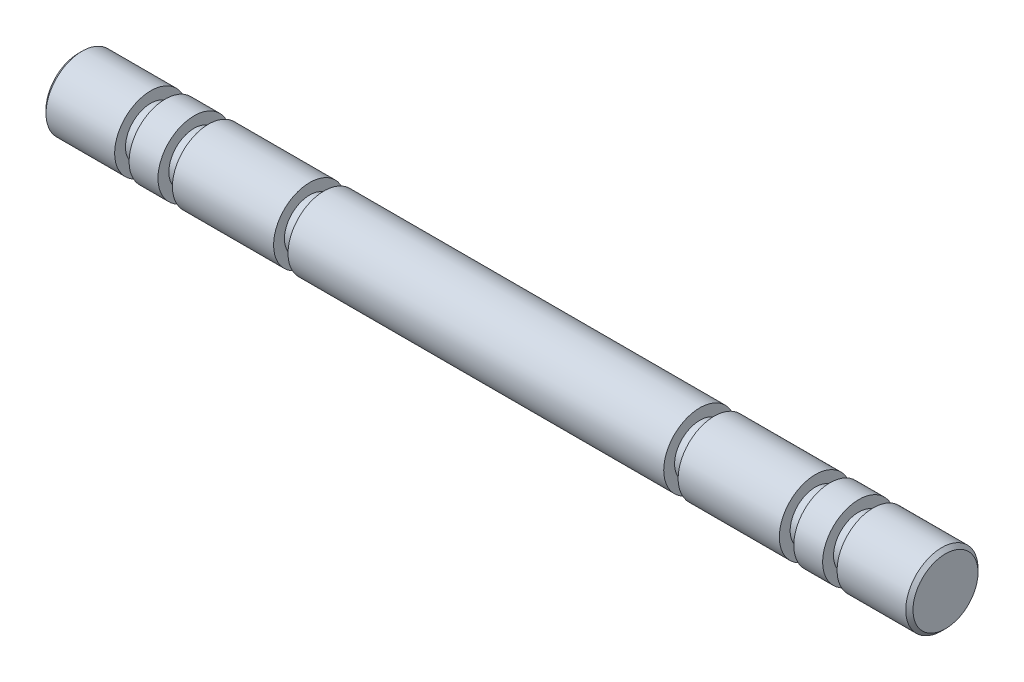
ISO-10303-21;
HEADER;
FILE_DESCRIPTION(('STEP AP214'),'2;1');
FILE_NAME('part.step','',(''),(''),'','','');
FILE_SCHEMA(('AUTOMOTIVE_DESIGN { 1 0 10303 214 1 1 1 1 }'));
ENDSEC;
DATA;
#1=APPLICATION_CONTEXT('core data for automotive mechanical design processes');
#2=APPLICATION_PROTOCOL_DEFINITION('international standard','automotive_design',2000,#1);
#3=PRODUCT_CONTEXT('',#1,'mechanical');
#4=PRODUCT('Part','Part','',(#3));
#5=PRODUCT_RELATED_PRODUCT_CATEGORY('part','',(#4));
#6=PRODUCT_DEFINITION_FORMATION('','',#4);
#7=PRODUCT_DEFINITION_CONTEXT('part definition',#1,'design');
#8=PRODUCT_DEFINITION('design','',#6,#7);
#9=PRODUCT_DEFINITION_SHAPE('','',#8);
#10=(LENGTH_UNIT() NAMED_UNIT(*) SI_UNIT(.MILLI.,.METRE.));
#11=(NAMED_UNIT(*) PLANE_ANGLE_UNIT() SI_UNIT($,.RADIAN.));
#12=(NAMED_UNIT(*) SI_UNIT($,.STERADIAN.) SOLID_ANGLE_UNIT());
#13=UNCERTAINTY_MEASURE_WITH_UNIT(LENGTH_MEASURE(1.E-05),#10,'distance_accuracy_value','');
#14=(GEOMETRIC_REPRESENTATION_CONTEXT(3) GLOBAL_UNCERTAINTY_ASSIGNED_CONTEXT((#13)) GLOBAL_UNIT_ASSIGNED_CONTEXT((#10,
#11,#12)) REPRESENTATION_CONTEXT('',''));
#15=CARTESIAN_POINT('',(0.,0.,0.));
#16=DIRECTION('',(0.,0.,1.));
#17=DIRECTION('',(1.,0.,0.));
#18=AXIS2_PLACEMENT_3D('',#15,#16,#17);
#19=CARTESIAN_POINT('',(52.,0.,0.));
#20=DIRECTION('',(-1.,0.,0.));
#21=DIRECTION('',(0.,0.,1.));
#22=AXIS2_PLACEMENT_3D('',#19,#20,#21);
#23=CYLINDRICAL_SURFACE('',#22,5.);
#24=CARTESIAN_POINT('',(52.,0.,0.));
#25=DIRECTION('',(1.,0.,0.));
#26=DIRECTION('',(0.,0.,-1.));
#27=AXIS2_PLACEMENT_3D('',#24,#25,#26);
#28=CIRCLE('',#27,5.);
#29=CARTESIAN_POINT('',(52.,0.,5.));
#30=VERTEX_POINT('',#29);
#31=EDGE_CURVE('E61',#30,#30,#28,.T.);
#32=CARTESIAN_POINT('',(0.,0.,0.));
#33=DIRECTION('',(1.,0.,0.));
#34=DIRECTION('',(0.,0.,-1.));
#35=AXIS2_PLACEMENT_3D('',#32,#33,#34);
#36=CIRCLE('',#35,5.);
#37=CARTESIAN_POINT('',(0.,0.,5.));
#38=VERTEX_POINT('',#37);
#39=EDGE_CURVE('E58',#38,#38,#36,.T.);
#40=CARTESIAN_POINT('',(52.,0.,5.));
#41=CARTESIAN_POINT('',(51.4583333333333,0.,5.));
#42=CARTESIAN_POINT('',(50.9166666666667,0.,5.));
#43=CARTESIAN_POINT('',(49.8333333333333,0.,5.));
#44=CARTESIAN_POINT('',(49.2916666666667,0.,5.));
#45=CARTESIAN_POINT('',(48.2083333333333,0.,5.));
#46=CARTESIAN_POINT('',(47.6666666666667,0.,5.));
#47=CARTESIAN_POINT('',(46.5833333333333,0.,5.));
#48=CARTESIAN_POINT('',(46.0416666666667,0.,5.));
#49=CARTESIAN_POINT('',(44.9583333333333,0.,5.));
#50=CARTESIAN_POINT('',(44.4166666666667,0.,5.));
#51=CARTESIAN_POINT('',(43.3333333333333,0.,5.));
#52=CARTESIAN_POINT('',(42.7916666666667,0.,5.));
#53=CARTESIAN_POINT('',(41.7083333333333,0.,5.));
#54=CARTESIAN_POINT('',(41.1666666666667,0.,5.));
#55=CARTESIAN_POINT('',(40.0833333333333,0.,5.));
#56=CARTESIAN_POINT('',(39.5416666666667,0.,5.));
#57=CARTESIAN_POINT('',(38.4583333333333,0.,5.));
#58=CARTESIAN_POINT('',(37.9166666666667,0.,5.));
#59=CARTESIAN_POINT('',(36.8333333333333,0.,5.));
#60=CARTESIAN_POINT('',(36.2916666666667,0.,5.));
#61=CARTESIAN_POINT('',(35.2083333333333,0.,5.));
#62=CARTESIAN_POINT('',(34.6666666666667,0.,5.));
#63=CARTESIAN_POINT('',(33.5833333333333,0.,5.));
#64=CARTESIAN_POINT('',(33.0416666666667,0.,5.));
#65=CARTESIAN_POINT('',(31.9583333333333,0.,5.));
#66=CARTESIAN_POINT('',(31.4166666666667,0.,5.));
#67=CARTESIAN_POINT('',(30.3333333333333,0.,5.));
#68=CARTESIAN_POINT('',(29.7916666666667,0.,5.));
#69=CARTESIAN_POINT('',(28.7083333333333,0.,5.));
#70=CARTESIAN_POINT('',(28.1666666666667,0.,5.));
#71=CARTESIAN_POINT('',(27.0833333333333,0.,5.));
#72=CARTESIAN_POINT('',(26.5416666666667,0.,5.));
#73=CARTESIAN_POINT('',(25.4583333333333,0.,5.));
#74=CARTESIAN_POINT('',(24.9166666666667,0.,5.));
#75=CARTESIAN_POINT('',(23.8333333333333,0.,5.));
#76=CARTESIAN_POINT('',(23.2916666666667,0.,5.));
#77=CARTESIAN_POINT('',(22.2083333333333,0.,5.));
#78=CARTESIAN_POINT('',(21.6666666666667,0.,5.));
#79=CARTESIAN_POINT('',(20.5833333333333,0.,5.));
#80=CARTESIAN_POINT('',(20.0416666666667,0.,5.));
#81=CARTESIAN_POINT('',(18.9583333333333,0.,5.));
#82=CARTESIAN_POINT('',(18.4166666666667,0.,5.));
#83=CARTESIAN_POINT('',(17.3333333333333,0.,5.));
#84=CARTESIAN_POINT('',(16.7916666666667,0.,5.));
#85=CARTESIAN_POINT('',(15.7083333333333,0.,5.));
#86=CARTESIAN_POINT('',(15.1666666666667,0.,5.));
#87=CARTESIAN_POINT('',(14.0833333333333,0.,5.));
#88=CARTESIAN_POINT('',(13.5416666666667,0.,5.));
#89=CARTESIAN_POINT('',(12.4583333333333,0.,5.));
#90=CARTESIAN_POINT('',(11.9166666666667,0.,5.));
#91=CARTESIAN_POINT('',(10.8333333333333,0.,5.));
#92=CARTESIAN_POINT('',(10.2916666666667,0.,5.));
#93=CARTESIAN_POINT('',(9.20833333333333,0.,5.));
#94=CARTESIAN_POINT('',(8.66666666666667,0.,5.));
#95=CARTESIAN_POINT('',(7.58333333333333,0.,5.));
#96=CARTESIAN_POINT('',(7.04166666666667,0.,5.));
#97=CARTESIAN_POINT('',(5.95833333333333,0.,5.));
#98=CARTESIAN_POINT('',(5.41666666666667,0.,5.));
#99=CARTESIAN_POINT('',(4.33333333333333,0.,5.));
#100=CARTESIAN_POINT('',(3.79166666666667,0.,5.));
#101=CARTESIAN_POINT('',(2.70833333333334,0.,5.));
#102=CARTESIAN_POINT('',(2.16666666666667,0.,5.));
#103=CARTESIAN_POINT('',(1.08333333333333,0.,5.));
#104=CARTESIAN_POINT('',(0.541666666666667,0.,5.));
#105=CARTESIAN_POINT('',(0.,0.,5.));
#106=B_SPLINE_CURVE_WITH_KNOTS('',3,(#40,#41,#42,#43,#44,#45,#46,#47,#48,#49,#50,#51,#52,#53,
#54,#55,#56,#57,#58,#59,#60,#61,#62,#63,#64,#65,#66,#67,#68,#69,#70,#71,#72,#73,#74,#75,#76,#77,
#78,#79,#80,#81,#82,#83,#84,#85,#86,#87,#88,#89,#90,#91,#92,#93,#94,#95,#96,#97,#98,#99,#100,
#101,#102,#103,#104,#105),.UNSPECIFIED.,.F.,.F.,(4,2,2,2,2,2,2,2,2,2,2,2,2,2,2,2,2,2,2,2,2,2,2,
2,2,2,2,2,2,2,2,2,4),(0.,1.625,3.25,4.875,6.50000000000001,8.125,9.75,11.375,13.,14.625,16.25,
17.875,19.5,21.125,22.75,24.375,26.,27.625,29.25,30.875,32.5,34.125,35.75,37.375,39.,40.625,
42.25,43.875,45.5,47.125,48.75,50.375,52.),.UNSPECIFIED.);
#107=EDGE_CURVE('BSEAM36',#30,#38,#106,.T.);
#108=ORIENTED_EDGE('',*,*,#31,.F.);
#109=ORIENTED_EDGE('',*,*,#39,.T.);
#110=ORIENTED_EDGE('',*,*,#107,.T.);
#111=ORIENTED_EDGE('',*,*,#107,.F.);
#112=EDGE_LOOP('',(#108,#110,#109,#111));
#113=FACE_BOUND('',#112,.T.);
#114=ADVANCED_FACE('F36',(#113),#23,.T.);
#115=CARTESIAN_POINT('',(52.,0.,0.));
#116=DIRECTION('',(1.,0.,0.));
#117=DIRECTION('',(0.,0.,-1.));
#118=AXIS2_PLACEMENT_3D('',#115,#116,#117);
#119=PLANE('',#118);
#120=CARTESIAN_POINT('',(52.,0.,0.));
#121=DIRECTION('',(1.,0.,0.));
#122=DIRECTION('',(0.,0.,-1.));
#123=AXIS2_PLACEMENT_3D('',#120,#121,#122);
#124=CIRCLE('',#123,3.5);
#125=CARTESIAN_POINT('',(52.,0.,-3.5));
#126=VERTEX_POINT('',#125);
#127=EDGE_CURVE('E65',#126,#126,#124,.T.);
#128=ORIENTED_EDGE('',*,*,#127,.F.);
#129=EDGE_LOOP('',(#128));
#130=FACE_BOUND('',#129,.T.);
#131=ORIENTED_EDGE('',*,*,#31,.T.);
#132=EDGE_LOOP('',(#131));
#133=FACE_BOUND('',#132,.T.);
#134=ADVANCED_FACE('F147',(#130,#133),#119,.T.);
#135=CARTESIAN_POINT('',(0.,0.,0.));
#136=DIRECTION('',(1.,0.,0.));
#137=DIRECTION('',(0.,0.,-1.));
#138=AXIS2_PLACEMENT_3D('',#135,#136,#137);
#139=PLANE('',#138);
#140=CARTESIAN_POINT('',(0.,0.,0.));
#141=DIRECTION('',(-1.,0.,0.));
#142=DIRECTION('',(0.,0.,1.));
#143=AXIS2_PLACEMENT_3D('',#140,#141,#142);
#144=CIRCLE('',#143,3.5);
#145=CARTESIAN_POINT('',(0.,0.,3.5));
#146=VERTEX_POINT('',#145);
#147=EDGE_CURVE('E92',#146,#146,#144,.T.);
#148=ORIENTED_EDGE('',*,*,#147,.F.);
#149=EDGE_LOOP('',(#148));
#150=FACE_BOUND('',#149,.T.);
#151=ORIENTED_EDGE('',*,*,#39,.F.);
#152=EDGE_LOOP('',(#151));
#153=FACE_BOUND('',#152,.T.);
#154=ADVANCED_FACE('F153',(#150,#153),#139,.F.);
#155=CARTESIAN_POINT('',(54.,0.,0.));
#156=DIRECTION('',(-1.,0.,0.));
#157=DIRECTION('',(0.,0.,1.));
#158=AXIS2_PLACEMENT_3D('',#155,#156,#157);
#159=CYLINDRICAL_SURFACE('',#158,3.5);
#160=CARTESIAN_POINT('',(54.,0.,0.));
#161=DIRECTION('',(1.,0.,0.));
#162=DIRECTION('',(0.,0.,-1.));
#163=AXIS2_PLACEMENT_3D('',#160,#161,#162);
#164=CIRCLE('',#163,3.5);
#165=CARTESIAN_POINT('',(54.,0.,-3.5));
#166=VERTEX_POINT('',#165);
#167=EDGE_CURVE('E62',#166,#166,#164,.T.);
#168=ORIENTED_EDGE('',*,*,#167,.F.);
#169=EDGE_LOOP('',(#168));
#170=FACE_BOUND('',#169,.T.);
#171=ORIENTED_EDGE('',*,*,#127,.T.);
#172=EDGE_LOOP('',(#171));
#173=FACE_BOUND('',#172,.T.);
#174=ADVANCED_FACE('F165',(#170,#173),#159,.T.);
#175=CARTESIAN_POINT('',(68.,0.,0.));
#176=DIRECTION('',(-1.,0.,0.));
#177=DIRECTION('',(0.,0.,1.));
#178=AXIS2_PLACEMENT_3D('',#175,#176,#177);
#179=CYLINDRICAL_SURFACE('',#178,5.);
#180=CARTESIAN_POINT('',(68.,0.,0.));
#181=DIRECTION('',(1.,0.,0.));
#182=DIRECTION('',(0.,0.,-1.));
#183=AXIS2_PLACEMENT_3D('',#180,#181,#182);
#184=CIRCLE('',#183,5.);
#185=CARTESIAN_POINT('',(68.,0.,-5.));
#186=VERTEX_POINT('',#185);
#187=EDGE_CURVE('E71',#186,#186,#184,.T.);
#188=ORIENTED_EDGE('',*,*,#187,.F.);
#189=EDGE_LOOP('',(#188));
#190=FACE_BOUND('',#189,.T.);
#191=CARTESIAN_POINT('',(54.,0.,0.));
#192=DIRECTION('',(1.,0.,0.));
#193=DIRECTION('',(0.,0.,-1.));
#194=AXIS2_PLACEMENT_3D('',#191,#192,#193);
#195=CIRCLE('',#194,5.);
#196=CARTESIAN_POINT('',(54.,0.,-5.));
#197=VERTEX_POINT('',#196);
#198=EDGE_CURVE('E72',#197,#197,#195,.T.);
#199=ORIENTED_EDGE('',*,*,#198,.T.);
#200=EDGE_LOOP('',(#199));
#201=FACE_BOUND('',#200,.T.);
#202=ADVANCED_FACE('F170',(#190,#201),#179,.T.);
#203=CARTESIAN_POINT('',(68.,0.,0.));
#204=DIRECTION('',(1.,0.,0.));
#205=DIRECTION('',(0.,0.,-1.));
#206=AXIS2_PLACEMENT_3D('',#203,#204,#205);
#207=PLANE('',#206);
#208=CARTESIAN_POINT('',(68.,0.,0.));
#209=DIRECTION('',(1.,0.,0.));
#210=DIRECTION('',(0.,0.,-1.));
#211=AXIS2_PLACEMENT_3D('',#208,#209,#210);
#212=CIRCLE('',#211,3.5);
#213=CARTESIAN_POINT('',(68.,0.,-3.5));
#214=VERTEX_POINT('',#213);
#215=EDGE_CURVE('E68',#214,#214,#212,.T.);
#216=ORIENTED_EDGE('',*,*,#215,.F.);
#217=EDGE_LOOP('',(#216));
#218=FACE_BOUND('',#217,.T.);
#219=ORIENTED_EDGE('',*,*,#187,.T.);
#220=EDGE_LOOP('',(#219));
#221=FACE_BOUND('',#220,.T.);
#222=ADVANCED_FACE('F174',(#218,#221),#207,.T.);
#223=CARTESIAN_POINT('',(54.,0.,0.));
#224=DIRECTION('',(1.,0.,0.));
#225=DIRECTION('',(0.,0.,-1.));
#226=AXIS2_PLACEMENT_3D('',#223,#224,#225);
#227=PLANE('',#226);
#228=ORIENTED_EDGE('',*,*,#167,.T.);
#229=EDGE_LOOP('',(#228));
#230=FACE_BOUND('',#229,.T.);
#231=ORIENTED_EDGE('',*,*,#198,.F.);
#232=EDGE_LOOP('',(#231));
#233=FACE_BOUND('',#232,.T.);
#234=ADVANCED_FACE('F176',(#230,#233),#227,.F.);
#235=CARTESIAN_POINT('',(70.,0.,0.));
#236=DIRECTION('',(-1.,0.,0.));
#237=DIRECTION('',(0.,0.,1.));
#238=AXIS2_PLACEMENT_3D('',#235,#236,#237);
#239=CYLINDRICAL_SURFACE('',#238,3.5);
#240=CARTESIAN_POINT('',(70.,0.,0.));
#241=DIRECTION('',(1.,0.,0.));
#242=DIRECTION('',(0.,0.,-1.));
#243=AXIS2_PLACEMENT_3D('',#240,#241,#242);
#244=CIRCLE('',#243,3.5);
#245=CARTESIAN_POINT('',(70.,0.,-3.5));
#246=VERTEX_POINT('',#245);
#247=EDGE_CURVE('E75',#246,#246,#244,.T.);
#248=ORIENTED_EDGE('',*,*,#247,.F.);
#249=EDGE_LOOP('',(#248));
#250=FACE_BOUND('',#249,.T.);
#251=ORIENTED_EDGE('',*,*,#215,.T.);
#252=EDGE_LOOP('',(#251));
#253=FACE_BOUND('',#252,.T.);
#254=ADVANCED_FACE('F179',(#250,#253),#239,.T.);
#255=CARTESIAN_POINT('',(74.,0.,0.));
#256=DIRECTION('',(-1.,0.,0.));
#257=DIRECTION('',(0.,0.,1.));
#258=AXIS2_PLACEMENT_3D('',#255,#256,#257);
#259=CYLINDRICAL_SURFACE('',#258,5.);
#260=CARTESIAN_POINT('',(74.,0.,0.));
#261=DIRECTION('',(1.,0.,0.));
#262=DIRECTION('',(0.,0.,-1.));
#263=AXIS2_PLACEMENT_3D('',#260,#261,#262);
#264=CIRCLE('',#263,5.);
#265=CARTESIAN_POINT('',(74.,0.,-5.));
#266=VERTEX_POINT('',#265);
#267=EDGE_CURVE('E83',#266,#266,#264,.T.);
#268=ORIENTED_EDGE('',*,*,#267,.F.);
#269=EDGE_LOOP('',(#268));
#270=FACE_BOUND('',#269,.T.);
#271=CARTESIAN_POINT('',(70.,0.,0.));
#272=DIRECTION('',(1.,0.,0.));
#273=DIRECTION('',(0.,0.,-1.));
#274=AXIS2_PLACEMENT_3D('',#271,#272,#273);
#275=CIRCLE('',#274,5.);
#276=CARTESIAN_POINT('',(70.,0.,-5.));
#277=VERTEX_POINT('',#276);
#278=EDGE_CURVE('E84',#277,#277,#275,.T.);
#279=ORIENTED_EDGE('',*,*,#278,.T.);
#280=EDGE_LOOP('',(#279));
#281=FACE_BOUND('',#280,.T.);
#282=ADVANCED_FACE('F186',(#270,#281),#259,.T.);
#283=CARTESIAN_POINT('',(74.,0.,0.));
#284=DIRECTION('',(1.,0.,0.));
#285=DIRECTION('',(0.,0.,-1.));
#286=AXIS2_PLACEMENT_3D('',#283,#284,#285);
#287=PLANE('',#286);
#288=CARTESIAN_POINT('',(74.,0.,0.));
#289=DIRECTION('',(1.,0.,0.));
#290=DIRECTION('',(0.,0.,-1.));
#291=AXIS2_PLACEMENT_3D('',#288,#289,#290);
#292=CIRCLE('',#291,3.5);
#293=CARTESIAN_POINT('',(74.,0.,-3.5));
#294=VERTEX_POINT('',#293);
#295=EDGE_CURVE('E80',#294,#294,#292,.T.);
#296=ORIENTED_EDGE('',*,*,#295,.F.);
#297=EDGE_LOOP('',(#296));
#298=FACE_BOUND('',#297,.T.);
#299=ORIENTED_EDGE('',*,*,#267,.T.);
#300=EDGE_LOOP('',(#299));
#301=FACE_BOUND('',#300,.T.);
#302=ADVANCED_FACE('F190',(#298,#301),#287,.T.);
#303=CARTESIAN_POINT('',(70.,0.,0.));
#304=DIRECTION('',(1.,0.,0.));
#305=DIRECTION('',(0.,0.,-1.));
#306=AXIS2_PLACEMENT_3D('',#303,#304,#305);
#307=PLANE('',#306);
#308=ORIENTED_EDGE('',*,*,#247,.T.);
#309=EDGE_LOOP('',(#308));
#310=FACE_BOUND('',#309,.T.);
#311=ORIENTED_EDGE('',*,*,#278,.F.);
#312=EDGE_LOOP('',(#311));
#313=FACE_BOUND('',#312,.T.);
#314=ADVANCED_FACE('F192',(#310,#313),#307,.F.);
#315=CARTESIAN_POINT('',(76.,0.,0.));
#316=DIRECTION('',(-1.,0.,0.));
#317=DIRECTION('',(0.,0.,1.));
#318=AXIS2_PLACEMENT_3D('',#315,#316,#317);
#319=CYLINDRICAL_SURFACE('',#318,3.5);
#320=CARTESIAN_POINT('',(76.,0.,0.));
#321=DIRECTION('',(1.,0.,0.));
#322=DIRECTION('',(0.,0.,-1.));
#323=AXIS2_PLACEMENT_3D('',#320,#321,#322);
#324=CIRCLE('',#323,3.5);
#325=CARTESIAN_POINT('',(76.,0.,-3.5));
#326=VERTEX_POINT('',#325);
#327=EDGE_CURVE('E87',#326,#326,#324,.T.);
#328=ORIENTED_EDGE('',*,*,#327,.F.);
#329=EDGE_LOOP('',(#328));
#330=FACE_BOUND('',#329,.T.);
#331=ORIENTED_EDGE('',*,*,#295,.T.);
#332=EDGE_LOOP('',(#331));
#333=FACE_BOUND('',#332,.T.);
#334=ADVANCED_FACE('F195',(#330,#333),#319,.T.);
#335=CARTESIAN_POINT('',(86.,0.,0.));
#336=DIRECTION('',(-1.,0.,0.));
#337=DIRECTION('',(0.,0.,1.));
#338=AXIS2_PLACEMENT_3D('',#335,#336,#337);
#339=CYLINDRICAL_SURFACE('',#338,5.);
#340=CARTESIAN_POINT('',(85.5,0.,0.));
#341=DIRECTION('',(1.,0.,0.));
#342=DIRECTION('',(0.,0.,-1.));
#343=AXIS2_PLACEMENT_3D('',#340,#341,#342);
#344=CIRCLE('',#343,5.);
#345=CARTESIAN_POINT('',(85.5,0.,-5.));
#346=VERTEX_POINT('',#345);
#347=EDGE_CURVE('E10',#346,#346,#344,.F.);
#348=ORIENTED_EDGE('',*,*,#347,.T.);
#349=EDGE_LOOP('',(#348));
#350=FACE_BOUND('',#349,.T.);
#351=CARTESIAN_POINT('',(76.,0.,0.));
#352=DIRECTION('',(1.,0.,0.));
#353=DIRECTION('',(0.,0.,-1.));
#354=AXIS2_PLACEMENT_3D('',#351,#352,#353);
#355=CIRCLE('',#354,5.);
#356=CARTESIAN_POINT('',(76.,0.,-5.));
#357=VERTEX_POINT('',#356);
#358=EDGE_CURVE('E95',#357,#357,#355,.T.);
#359=ORIENTED_EDGE('',*,*,#358,.T.);
#360=EDGE_LOOP('',(#359));
#361=FACE_BOUND('',#360,.T.);
#362=ADVANCED_FACE('F202',(#350,#361),#339,.T.);
#363=CARTESIAN_POINT('',(86.,0.,0.));
#364=DIRECTION('',(1.,0.,0.));
#365=DIRECTION('',(0.,0.,-1.));
#366=AXIS2_PLACEMENT_3D('',#363,#364,#365);
#367=PLANE('',#366);
#368=CARTESIAN_POINT('',(86.,0.,0.));
#369=DIRECTION('',(1.,0.,0.));
#370=DIRECTION('',(0.,0.,-1.));
#371=AXIS2_PLACEMENT_3D('',#368,#369,#370);
#372=CIRCLE('',#371,4.49999999999999);
#373=CARTESIAN_POINT('',(86.,0.,-4.49999999999999));
#374=VERTEX_POINT('',#373);
#375=EDGE_CURVE('E44',#374,#374,#372,.T.);
#376=ORIENTED_EDGE('',*,*,#375,.T.);
#377=EDGE_LOOP('',(#376));
#378=FACE_BOUND('',#377,.T.);
#379=ADVANCED_FACE('F206',(#378),#367,.T.);
#380=CARTESIAN_POINT('',(76.,0.,0.));
#381=DIRECTION('',(1.,0.,0.));
#382=DIRECTION('',(0.,0.,-1.));
#383=AXIS2_PLACEMENT_3D('',#380,#381,#382);
#384=PLANE('',#383);
#385=ORIENTED_EDGE('',*,*,#327,.T.);
#386=EDGE_LOOP('',(#385));
#387=FACE_BOUND('',#386,.T.);
#388=ORIENTED_EDGE('',*,*,#358,.F.);
#389=EDGE_LOOP('',(#388));
#390=FACE_BOUND('',#389,.T.);
#391=ADVANCED_FACE('F207',(#387,#390),#384,.F.);
#392=CARTESIAN_POINT('',(-2.,0.,0.));
#393=DIRECTION('',(1.,0.,0.));
#394=DIRECTION('',(0.,0.,-1.));
#395=AXIS2_PLACEMENT_3D('',#392,#393,#394);
#396=CYLINDRICAL_SURFACE('',#395,3.5);
#397=CARTESIAN_POINT('',(-2.,0.,0.));
#398=DIRECTION('',(-1.,0.,0.));
#399=DIRECTION('',(0.,0.,1.));
#400=AXIS2_PLACEMENT_3D('',#397,#398,#399);
#401=CIRCLE('',#400,3.5);
#402=CARTESIAN_POINT('',(-2.,0.,3.5));
#403=VERTEX_POINT('',#402);
#404=EDGE_CURVE('E98',#403,#403,#401,.T.);
#405=ORIENTED_EDGE('',*,*,#404,.F.);
#406=EDGE_LOOP('',(#405));
#407=FACE_BOUND('',#406,.T.);
#408=ORIENTED_EDGE('',*,*,#147,.T.);
#409=EDGE_LOOP('',(#408));
#410=FACE_BOUND('',#409,.T.);
#411=ADVANCED_FACE('F210',(#407,#410),#396,.T.);
#412=CARTESIAN_POINT('',(-16.,0.,0.));
#413=DIRECTION('',(1.,0.,0.));
#414=DIRECTION('',(0.,0.,-1.));
#415=AXIS2_PLACEMENT_3D('',#412,#413,#414);
#416=CYLINDRICAL_SURFACE('',#415,5.);
#417=CARTESIAN_POINT('',(-16.,0.,0.));
#418=DIRECTION('',(-1.,0.,0.));
#419=DIRECTION('',(0.,0.,1.));
#420=AXIS2_PLACEMENT_3D('',#417,#418,#419);
#421=CIRCLE('',#420,5.);
#422=CARTESIAN_POINT('',(-16.,0.,5.));
#423=VERTEX_POINT('',#422);
#424=EDGE_CURVE('E104',#423,#423,#421,.T.);
#425=ORIENTED_EDGE('',*,*,#424,.F.);
#426=EDGE_LOOP('',(#425));
#427=FACE_BOUND('',#426,.T.);
#428=CARTESIAN_POINT('',(-2.,0.,0.));
#429=DIRECTION('',(-1.,0.,0.));
#430=DIRECTION('',(0.,0.,1.));
#431=AXIS2_PLACEMENT_3D('',#428,#429,#430);
#432=CIRCLE('',#431,5.);
#433=CARTESIAN_POINT('',(-2.,0.,5.));
#434=VERTEX_POINT('',#433);
#435=EDGE_CURVE('E105',#434,#434,#432,.T.);
#436=ORIENTED_EDGE('',*,*,#435,.T.);
#437=EDGE_LOOP('',(#436));
#438=FACE_BOUND('',#437,.T.);
#439=ADVANCED_FACE('F216',(#427,#438),#416,.T.);
#440=CARTESIAN_POINT('',(-16.,0.,0.));
#441=DIRECTION('',(-1.,0.,0.));
#442=DIRECTION('',(0.,0.,1.));
#443=AXIS2_PLACEMENT_3D('',#440,#441,#442);
#444=PLANE('',#443);
#445=CARTESIAN_POINT('',(-16.,0.,0.));
#446=DIRECTION('',(-1.,0.,0.));
#447=DIRECTION('',(0.,0.,1.));
#448=AXIS2_PLACEMENT_3D('',#445,#446,#447);
#449=CIRCLE('',#448,3.5);
#450=CARTESIAN_POINT('',(-16.,0.,3.5));
#451=VERTEX_POINT('',#450);
#452=EDGE_CURVE('E101',#451,#451,#449,.T.);
#453=ORIENTED_EDGE('',*,*,#452,.F.);
#454=EDGE_LOOP('',(#453));
#455=FACE_BOUND('',#454,.T.);
#456=ORIENTED_EDGE('',*,*,#424,.T.);
#457=EDGE_LOOP('',(#456));
#458=FACE_BOUND('',#457,.T.);
#459=ADVANCED_FACE('F220',(#455,#458),#444,.T.);
#460=CARTESIAN_POINT('',(-2.,0.,0.));
#461=DIRECTION('',(-1.,0.,0.));
#462=DIRECTION('',(0.,0.,1.));
#463=AXIS2_PLACEMENT_3D('',#460,#461,#462);
#464=PLANE('',#463);
#465=ORIENTED_EDGE('',*,*,#404,.T.);
#466=EDGE_LOOP('',(#465));
#467=FACE_BOUND('',#466,.T.);
#468=ORIENTED_EDGE('',*,*,#435,.F.);
#469=EDGE_LOOP('',(#468));
#470=FACE_BOUND('',#469,.T.);
#471=ADVANCED_FACE('F222',(#467,#470),#464,.F.);
#472=CARTESIAN_POINT('',(-18.,0.,0.));
#473=DIRECTION('',(1.,0.,0.));
#474=DIRECTION('',(0.,0.,-1.));
#475=AXIS2_PLACEMENT_3D('',#472,#473,#474);
#476=CYLINDRICAL_SURFACE('',#475,3.5);
#477=CARTESIAN_POINT('',(-18.,0.,0.));
#478=DIRECTION('',(-1.,0.,0.));
#479=DIRECTION('',(0.,0.,1.));
#480=AXIS2_PLACEMENT_3D('',#477,#478,#479);
#481=CIRCLE('',#480,3.5);
#482=CARTESIAN_POINT('',(-18.,0.,3.5));
#483=VERTEX_POINT('',#482);
#484=EDGE_CURVE('E108',#483,#483,#481,.T.);
#485=ORIENTED_EDGE('',*,*,#484,.F.);
#486=EDGE_LOOP('',(#485));
#487=FACE_BOUND('',#486,.T.);
#488=ORIENTED_EDGE('',*,*,#452,.T.);
#489=EDGE_LOOP('',(#488));
#490=FACE_BOUND('',#489,.T.);
#491=ADVANCED_FACE('F225',(#487,#490),#476,.T.);
#492=CARTESIAN_POINT('',(-22.,0.,0.));
#493=DIRECTION('',(1.,0.,0.));
#494=DIRECTION('',(0.,0.,-1.));
#495=AXIS2_PLACEMENT_3D('',#492,#493,#494);
#496=CYLINDRICAL_SURFACE('',#495,5.);
#497=CARTESIAN_POINT('',(-22.,0.,0.));
#498=DIRECTION('',(-1.,0.,0.));
#499=DIRECTION('',(0.,0.,1.));
#500=AXIS2_PLACEMENT_3D('',#497,#498,#499);
#501=CIRCLE('',#500,5.);
#502=CARTESIAN_POINT('',(-22.,0.,5.));
#503=VERTEX_POINT('',#502);
#504=EDGE_CURVE('E115',#503,#503,#501,.T.);
#505=ORIENTED_EDGE('',*,*,#504,.F.);
#506=EDGE_LOOP('',(#505));
#507=FACE_BOUND('',#506,.T.);
#508=CARTESIAN_POINT('',(-18.,0.,0.));
#509=DIRECTION('',(-1.,0.,0.));
#510=DIRECTION('',(0.,0.,1.));
#511=AXIS2_PLACEMENT_3D('',#508,#509,#510);
#512=CIRCLE('',#511,5.);
#513=CARTESIAN_POINT('',(-18.,0.,5.));
#514=VERTEX_POINT('',#513);
#515=EDGE_CURVE('E116',#514,#514,#512,.T.);
#516=ORIENTED_EDGE('',*,*,#515,.T.);
#517=EDGE_LOOP('',(#516));
#518=FACE_BOUND('',#517,.T.);
#519=ADVANCED_FACE('F232',(#507,#518),#496,.T.);
#520=CARTESIAN_POINT('',(-22.,0.,0.));
#521=DIRECTION('',(-1.,0.,0.));
#522=DIRECTION('',(0.,0.,1.));
#523=AXIS2_PLACEMENT_3D('',#520,#521,#522);
#524=PLANE('',#523);
#525=CARTESIAN_POINT('',(-22.,0.,0.));
#526=DIRECTION('',(-1.,0.,0.));
#527=DIRECTION('',(0.,0.,1.));
#528=AXIS2_PLACEMENT_3D('',#525,#526,#527);
#529=CIRCLE('',#528,3.5);
#530=CARTESIAN_POINT('',(-22.,0.,3.5));
#531=VERTEX_POINT('',#530);
#532=EDGE_CURVE('E57',#531,#531,#529,.T.);
#533=ORIENTED_EDGE('',*,*,#532,.F.);
#534=EDGE_LOOP('',(#533));
#535=FACE_BOUND('',#534,.T.);
#536=ORIENTED_EDGE('',*,*,#504,.T.);
#537=EDGE_LOOP('',(#536));
#538=FACE_BOUND('',#537,.T.);
#539=ADVANCED_FACE('F236',(#535,#538),#524,.T.);
#540=CARTESIAN_POINT('',(-18.,0.,0.));
#541=DIRECTION('',(-1.,0.,0.));
#542=DIRECTION('',(0.,0.,1.));
#543=AXIS2_PLACEMENT_3D('',#540,#541,#542);
#544=PLANE('',#543);
#545=ORIENTED_EDGE('',*,*,#484,.T.);
#546=EDGE_LOOP('',(#545));
#547=FACE_BOUND('',#546,.T.);
#548=ORIENTED_EDGE('',*,*,#515,.F.);
#549=EDGE_LOOP('',(#548));
#550=FACE_BOUND('',#549,.T.);
#551=ADVANCED_FACE('F238',(#547,#550),#544,.F.);
#552=CARTESIAN_POINT('',(-24.,0.,0.));
#553=DIRECTION('',(1.,0.,0.));
#554=DIRECTION('',(0.,0.,-1.));
#555=AXIS2_PLACEMENT_3D('',#552,#553,#554);
#556=CYLINDRICAL_SURFACE('',#555,3.5);
#557=CARTESIAN_POINT('',(-24.,0.,0.));
#558=DIRECTION('',(-1.,0.,0.));
#559=DIRECTION('',(0.,0.,1.));
#560=AXIS2_PLACEMENT_3D('',#557,#558,#559);
#561=CIRCLE('',#560,3.5);
#562=CARTESIAN_POINT('',(-24.,0.,3.5));
#563=VERTEX_POINT('',#562);
#564=EDGE_CURVE('E119',#563,#563,#561,.T.);
#565=ORIENTED_EDGE('',*,*,#564,.F.);
#566=EDGE_LOOP('',(#565));
#567=FACE_BOUND('',#566,.T.);
#568=ORIENTED_EDGE('',*,*,#532,.T.);
#569=EDGE_LOOP('',(#568));
#570=FACE_BOUND('',#569,.T.);
#571=ADVANCED_FACE('F241',(#567,#570),#556,.T.);
#572=CARTESIAN_POINT('',(-34.,0.,0.));
#573=DIRECTION('',(1.,0.,0.));
#574=DIRECTION('',(0.,0.,-1.));
#575=AXIS2_PLACEMENT_3D('',#572,#573,#574);
#576=CYLINDRICAL_SURFACE('',#575,5.);
#577=CARTESIAN_POINT('',(-33.5,0.,0.));
#578=DIRECTION('',(-1.,0.,0.));
#579=DIRECTION('',(0.,0.,1.));
#580=AXIS2_PLACEMENT_3D('',#577,#578,#579);
#581=CIRCLE('',#580,5.);
#582=CARTESIAN_POINT('',(-33.5,0.,5.));
#583=VERTEX_POINT('',#582);
#584=EDGE_CURVE('E48',#583,#583,#581,.F.);
#585=ORIENTED_EDGE('',*,*,#584,.T.);
#586=EDGE_LOOP('',(#585));
#587=FACE_BOUND('',#586,.T.);
#588=CARTESIAN_POINT('',(-24.,0.,0.));
#589=DIRECTION('',(-1.,0.,0.));
#590=DIRECTION('',(0.,0.,1.));
#591=AXIS2_PLACEMENT_3D('',#588,#589,#590);
#592=CIRCLE('',#591,5.);
#593=CARTESIAN_POINT('',(-24.,0.,5.));
#594=VERTEX_POINT('',#593);
#595=EDGE_CURVE('E126',#594,#594,#592,.T.);
#596=ORIENTED_EDGE('',*,*,#595,.T.);
#597=EDGE_LOOP('',(#596));
#598=FACE_BOUND('',#597,.T.);
#599=ADVANCED_FACE('F130',(#587,#598),#576,.T.);
#600=CARTESIAN_POINT('',(-34.,0.,0.));
#601=DIRECTION('',(-1.,0.,0.));
#602=DIRECTION('',(0.,0.,1.));
#603=AXIS2_PLACEMENT_3D('',#600,#601,#602);
#604=PLANE('',#603);
#605=CARTESIAN_POINT('',(-34.,0.,0.));
#606=DIRECTION('',(-1.,0.,0.));
#607=DIRECTION('',(0.,0.,1.));
#608=AXIS2_PLACEMENT_3D('',#605,#606,#607);
#609=CIRCLE('',#608,4.49999999999999);
#610=CARTESIAN_POINT('',(-34.,0.,4.49999999999999));
#611=VERTEX_POINT('',#610);
#612=EDGE_CURVE('E52',#611,#611,#609,.T.);
#613=ORIENTED_EDGE('',*,*,#612,.T.);
#614=EDGE_LOOP('',(#613));
#615=FACE_BOUND('',#614,.T.);
#616=ADVANCED_FACE('F135',(#615),#604,.T.);
#617=CARTESIAN_POINT('',(-24.,0.,0.));
#618=DIRECTION('',(-1.,0.,0.));
#619=DIRECTION('',(0.,0.,1.));
#620=AXIS2_PLACEMENT_3D('',#617,#618,#619);
#621=PLANE('',#620);
#622=ORIENTED_EDGE('',*,*,#564,.T.);
#623=EDGE_LOOP('',(#622));
#624=FACE_BOUND('',#623,.T.);
#625=ORIENTED_EDGE('',*,*,#595,.F.);
#626=EDGE_LOOP('',(#625));
#627=FACE_BOUND('',#626,.T.);
#628=ADVANCED_FACE('F132',(#624,#627),#621,.F.);
#629=CARTESIAN_POINT('',(-34.,0.,0.));
#630=DIRECTION('',(1.,0.,0.));
#631=DIRECTION('',(0.,0.,-1.));
#632=AXIS2_PLACEMENT_3D('',#629,#630,#631);
#633=CONICAL_SURFACE('',#632,4.49999999999999,0.785398163397444);
#634=ORIENTED_EDGE('',*,*,#584,.F.);
#635=EDGE_LOOP('',(#634));
#636=FACE_BOUND('',#635,.T.);
#637=ORIENTED_EDGE('',*,*,#612,.F.);
#638=EDGE_LOOP('',(#637));
#639=FACE_BOUND('',#638,.T.);
#640=ADVANCED_FACE('F134',(#636,#639),#633,.T.);
#641=CARTESIAN_POINT('',(86.,0.,0.));
#642=DIRECTION('',(-1.,0.,0.));
#643=DIRECTION('',(0.,0.,1.));
#644=AXIS2_PLACEMENT_3D('',#641,#642,#643);
#645=CONICAL_SURFACE('',#644,4.49999999999999,0.785398163397444);
#646=ORIENTED_EDGE('',*,*,#347,.F.);
#647=EDGE_LOOP('',(#646));
#648=FACE_BOUND('',#647,.T.);
#649=ORIENTED_EDGE('',*,*,#375,.F.);
#650=EDGE_LOOP('',(#649));
#651=FACE_BOUND('',#650,.T.);
#652=ADVANCED_FACE('F39',(#648,#651),#645,.T.);
#653=CLOSED_SHELL('',(#114,#134,#154,#174,#202,#222,#234,#254,#282,#302,#314,#334,#362,#379,
#391,#411,#439,#459,#471,#491,#519,#539,#551,#571,#599,#616,#628,#640,#652));
#654=MANIFOLD_SOLID_BREP('B2',#653);
#655=ADVANCED_BREP_SHAPE_REPRESENTATION('',(#18,#654),#14);
#656=SHAPE_DEFINITION_REPRESENTATION(#9,#655);
ENDSEC;
END-ISO-10303-21;
